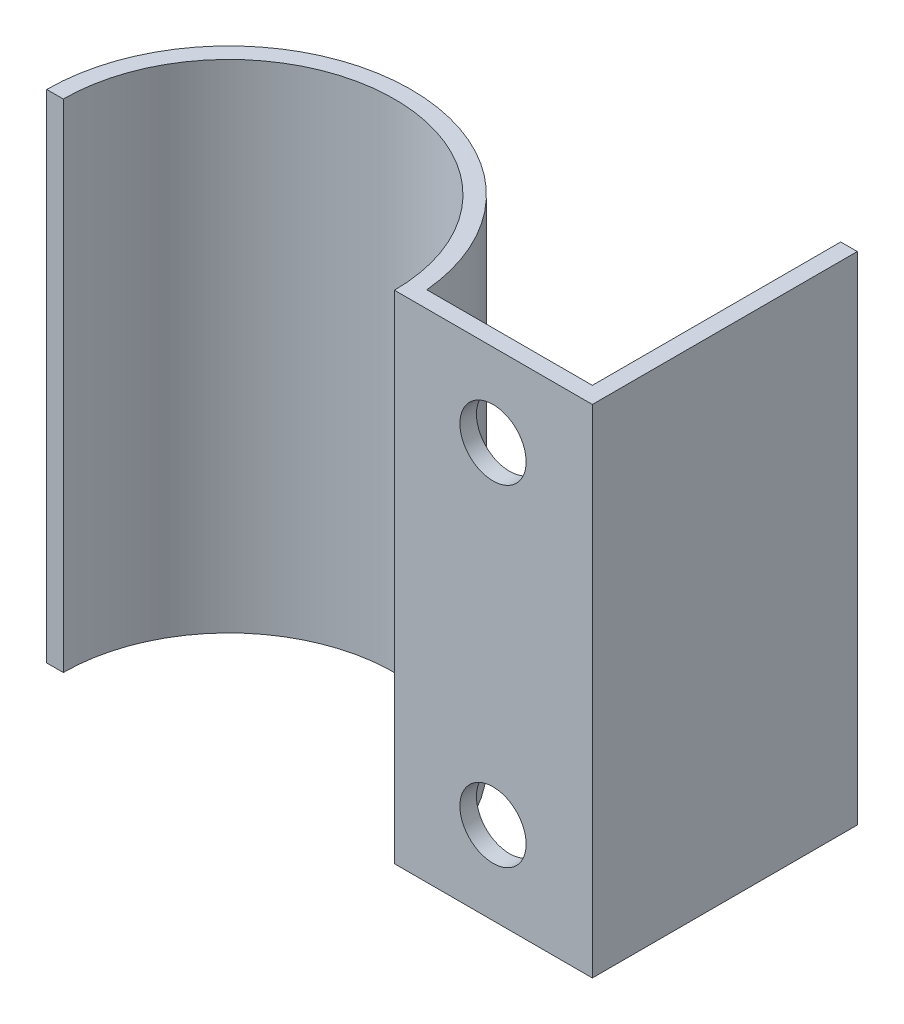
ISO-10303-21;
HEADER;
FILE_DESCRIPTION(('STEP AP214'),'2;1');
FILE_NAME('part.step','',(''),(''),'','','');
FILE_SCHEMA(('AUTOMOTIVE_DESIGN { 1 0 10303 214 1 1 1 1 }'));
ENDSEC;
DATA;
#1=APPLICATION_CONTEXT('core data for automotive mechanical design processes');
#2=APPLICATION_PROTOCOL_DEFINITION('international standard','automotive_design',2000,#1);
#3=PRODUCT_CONTEXT('',#1,'mechanical');
#4=PRODUCT('Part','Part','',(#3));
#5=PRODUCT_RELATED_PRODUCT_CATEGORY('part','',(#4));
#6=PRODUCT_DEFINITION_FORMATION('','',#4);
#7=PRODUCT_DEFINITION_CONTEXT('part definition',#1,'design');
#8=PRODUCT_DEFINITION('design','',#6,#7);
#9=PRODUCT_DEFINITION_SHAPE('','',#8);
#10=(LENGTH_UNIT() NAMED_UNIT(*) SI_UNIT(.MILLI.,.METRE.));
#11=(NAMED_UNIT(*) PLANE_ANGLE_UNIT() SI_UNIT($,.RADIAN.));
#12=(NAMED_UNIT(*) SI_UNIT($,.STERADIAN.) SOLID_ANGLE_UNIT());
#13=UNCERTAINTY_MEASURE_WITH_UNIT(LENGTH_MEASURE(1.E-05),#10,'distance_accuracy_value','');
#14=(GEOMETRIC_REPRESENTATION_CONTEXT(3) GLOBAL_UNCERTAINTY_ASSIGNED_CONTEXT((#13)) GLOBAL_UNIT_ASSIGNED_CONTEXT((#10,
#11,#12)) REPRESENTATION_CONTEXT('',''));
#15=CARTESIAN_POINT('',(0.,0.,0.));
#16=DIRECTION('',(0.,0.,1.));
#17=DIRECTION('',(1.,0.,0.));
#18=AXIS2_PLACEMENT_3D('',#15,#16,#17);
#19=CARTESIAN_POINT('',(0.,30.,0.));
#20=DIRECTION('',(0.,-1.,0.));
#21=DIRECTION('',(0.,0.,-1.));
#22=AXIS2_PLACEMENT_3D('',#19,#20,#21);
#23=CYLINDRICAL_SURFACE('',#22,11.);
#24=CARTESIAN_POINT('',(0.,0.,0.));
#25=DIRECTION('',(0.,1.,0.));
#26=DIRECTION('',(0.,0.,-1.));
#27=AXIS2_PLACEMENT_3D('',#24,#25,#26);
#28=CIRCLE('',#27,11.);
#29=CARTESIAN_POINT('',(10.9544511501033,0.,-1.));
#30=VERTEX_POINT('',#29);
#31=CARTESIAN_POINT('',(-11.,0.,0.));
#32=VERTEX_POINT('',#31);
#33=EDGE_CURVE('E129',#30,#32,#28,.T.);
#34=ORIENTED_EDGE('',*,*,#33,.T.);
#35=DIRECTION('',(0.,-1.,0.));
#36=VECTOR('',#35,1.);
#37=CARTESIAN_POINT('',(-11.,30.,0.));
#38=LINE('',#37,#36);
#39=CARTESIAN_POINT('',(-11.,30.,0.));
#40=VERTEX_POINT('',#39);
#41=EDGE_CURVE('E11',#40,#32,#38,.T.);
#42=ORIENTED_EDGE('',*,*,#41,.F.);
#43=CARTESIAN_POINT('',(0.,30.,0.));
#44=DIRECTION('',(0.,1.,0.));
#45=DIRECTION('',(0.,0.,-1.));
#46=AXIS2_PLACEMENT_3D('',#43,#44,#45);
#47=CIRCLE('',#46,11.);
#48=CARTESIAN_POINT('',(10.9544511501033,30.,-1.));
#49=VERTEX_POINT('',#48);
#50=EDGE_CURVE('E145',#49,#40,#47,.T.);
#51=ORIENTED_EDGE('',*,*,#50,.F.);
#52=DIRECTION('',(0.,-1.,0.));
#53=VECTOR('',#52,1.);
#54=CARTESIAN_POINT('',(10.9544511501033,30.,-1.));
#55=LINE('',#54,#53);
#56=EDGE_CURVE('E125',#49,#30,#55,.T.);
#57=ORIENTED_EDGE('',*,*,#56,.T.);
#58=EDGE_LOOP('',(#34,#42,#51,#57));
#59=FACE_BOUND('',#58,.T.);
#60=ADVANCED_FACE('F33',(#59),#23,.T.);
#61=CARTESIAN_POINT('',(-10.,30.,0.));
#62=DIRECTION('',(0.,0.,-1.));
#63=DIRECTION('',(-1.,0.,0.));
#64=AXIS2_PLACEMENT_3D('',#61,#62,#63);
#65=PLANE('',#64);
#66=DIRECTION('',(1.,0.,0.));
#67=VECTOR('',#66,1.);
#68=CARTESIAN_POINT('',(-10.,0.,0.));
#69=LINE('',#68,#67);
#70=CARTESIAN_POINT('',(-10.,0.,0.));
#71=VERTEX_POINT('',#70);
#72=EDGE_CURVE('E132',#32,#71,#69,.T.);
#73=ORIENTED_EDGE('',*,*,#72,.T.);
#74=DIRECTION('',(0.,-1.,0.));
#75=VECTOR('',#74,1.);
#76=CARTESIAN_POINT('',(-10.,30.,0.));
#77=LINE('',#76,#75);
#78=CARTESIAN_POINT('',(-10.,30.,0.));
#79=VERTEX_POINT('',#78);
#80=EDGE_CURVE('E41',#79,#71,#77,.T.);
#81=ORIENTED_EDGE('',*,*,#80,.F.);
#82=DIRECTION('',(1.,0.,0.));
#83=VECTOR('',#82,1.);
#84=CARTESIAN_POINT('',(-10.,30.,0.));
#85=LINE('',#84,#83);
#86=EDGE_CURVE('E92',#40,#79,#85,.T.);
#87=ORIENTED_EDGE('',*,*,#86,.F.);
#88=ORIENTED_EDGE('',*,*,#41,.T.);
#89=EDGE_LOOP('',(#73,#81,#87,#88));
#90=FACE_BOUND('',#89,.T.);
#91=ADVANCED_FACE('F212',(#90),#65,.F.);
#92=CARTESIAN_POINT('',(0.,30.,0.));
#93=DIRECTION('',(0.,-1.,0.));
#94=DIRECTION('',(0.,0.,-1.));
#95=AXIS2_PLACEMENT_3D('',#92,#93,#94);
#96=CYLINDRICAL_SURFACE('',#95,10.);
#97=CARTESIAN_POINT('',(0.,0.,0.));
#98=DIRECTION('',(0.,-1.,0.));
#99=DIRECTION('',(0.,0.,1.));
#100=AXIS2_PLACEMENT_3D('',#97,#98,#99);
#101=CIRCLE('',#100,10.);
#102=CARTESIAN_POINT('',(10.,0.,0.));
#103=VERTEX_POINT('',#102);
#104=EDGE_CURVE('E135',#71,#103,#101,.T.);
#105=ORIENTED_EDGE('',*,*,#104,.T.);
#106=DIRECTION('',(0.,-1.,0.));
#107=VECTOR('',#106,1.);
#108=CARTESIAN_POINT('',(10.,30.,0.));
#109=LINE('',#108,#107);
#110=CARTESIAN_POINT('',(10.,30.,0.));
#111=VERTEX_POINT('',#110);
#112=EDGE_CURVE('E152',#111,#103,#109,.T.);
#113=ORIENTED_EDGE('',*,*,#112,.F.);
#114=CARTESIAN_POINT('',(0.,30.,0.));
#115=DIRECTION('',(0.,-1.,0.));
#116=DIRECTION('',(0.,0.,1.));
#117=AXIS2_PLACEMENT_3D('',#114,#115,#116);
#118=CIRCLE('',#117,10.);
#119=EDGE_CURVE('E160',#79,#111,#118,.T.);
#120=ORIENTED_EDGE('',*,*,#119,.F.);
#121=ORIENTED_EDGE('',*,*,#80,.T.);
#122=EDGE_LOOP('',(#105,#113,#120,#121));
#123=FACE_BOUND('',#122,.T.);
#124=ADVANCED_FACE('F158',(#123),#96,.F.);
#125=CARTESIAN_POINT('',(21.9544511501033,30.,0.));
#126=DIRECTION('',(0.,0.,-1.));
#127=DIRECTION('',(-1.,0.,0.));
#128=AXIS2_PLACEMENT_3D('',#125,#126,#127);
#129=PLANE('',#128);
#130=CARTESIAN_POINT('',(15.9544511501033,25.,0.));
#131=DIRECTION('',(0.,0.,-1.));
#132=DIRECTION('',(-1.,0.,0.));
#133=AXIS2_PLACEMENT_3D('',#130,#131,#132);
#134=CIRCLE('',#133,2.);
#135=CARTESIAN_POINT('',(13.9544511501033,25.,0.));
#136=VERTEX_POINT('',#135);
#137=EDGE_CURVE('E133',#136,#136,#134,.T.);
#138=ORIENTED_EDGE('',*,*,#137,.T.);
#139=EDGE_LOOP('',(#138));
#140=FACE_BOUND('',#139,.T.);
#141=CARTESIAN_POINT('',(15.9544511501033,5.,0.));
#142=DIRECTION('',(0.,0.,-1.));
#143=DIRECTION('',(-1.,0.,0.));
#144=AXIS2_PLACEMENT_3D('',#141,#142,#143);
#145=CIRCLE('',#144,2.);
#146=CARTESIAN_POINT('',(13.9544511501033,5.,0.));
#147=VERTEX_POINT('',#146);
#148=EDGE_CURVE('E179',#147,#147,#145,.T.);
#149=ORIENTED_EDGE('',*,*,#148,.T.);
#150=EDGE_LOOP('',(#149));
#151=FACE_BOUND('',#150,.T.);
#152=DIRECTION('',(1.,0.,0.));
#153=VECTOR('',#152,1.);
#154=CARTESIAN_POINT('',(21.9544511501033,0.,0.));
#155=LINE('',#154,#153);
#156=CARTESIAN_POINT('',(21.9544511501033,0.,0.));
#157=VERTEX_POINT('',#156);
#158=EDGE_CURVE('E138',#103,#157,#155,.T.);
#159=ORIENTED_EDGE('',*,*,#158,.T.);
#160=DIRECTION('',(0.,-1.,0.));
#161=VECTOR('',#160,1.);
#162=CARTESIAN_POINT('',(21.9544511501033,30.,0.));
#163=LINE('',#162,#161);
#164=CARTESIAN_POINT('',(21.9544511501033,30.,0.));
#165=VERTEX_POINT('',#164);
#166=EDGE_CURVE('E149',#165,#157,#163,.T.);
#167=ORIENTED_EDGE('',*,*,#166,.F.);
#168=DIRECTION('',(1.,0.,0.));
#169=VECTOR('',#168,1.);
#170=CARTESIAN_POINT('',(10.,30.,0.));
#171=LINE('',#170,#169);
#172=EDGE_CURVE('E171',#111,#165,#171,.T.);
#173=ORIENTED_EDGE('',*,*,#172,.F.);
#174=ORIENTED_EDGE('',*,*,#112,.T.);
#175=EDGE_LOOP('',(#159,#167,#173,#174));
#176=FACE_BOUND('',#175,.T.);
#177=ADVANCED_FACE('F167',(#140,#151,#176),#129,.F.);
#178=CARTESIAN_POINT('',(21.9544511501033,30.,-16.));
#179=DIRECTION('',(-1.,0.,0.));
#180=DIRECTION('',(0.,0.,1.));
#181=AXIS2_PLACEMENT_3D('',#178,#179,#180);
#182=PLANE('',#181);
#183=DIRECTION('',(0.,0.,-1.));
#184=VECTOR('',#183,1.);
#185=CARTESIAN_POINT('',(21.9544511501033,0.,-16.));
#186=LINE('',#185,#184);
#187=CARTESIAN_POINT('',(21.9544511501033,0.,-16.));
#188=VERTEX_POINT('',#187);
#189=EDGE_CURVE('E140',#157,#188,#186,.T.);
#190=ORIENTED_EDGE('',*,*,#189,.T.);
#191=DIRECTION('',(0.,-1.,0.));
#192=VECTOR('',#191,1.);
#193=CARTESIAN_POINT('',(21.9544511501033,30.,-16.));
#194=LINE('',#193,#192);
#195=CARTESIAN_POINT('',(21.9544511501033,30.,-16.));
#196=VERTEX_POINT('',#195);
#197=EDGE_CURVE('E120',#196,#188,#194,.T.);
#198=ORIENTED_EDGE('',*,*,#197,.F.);
#199=DIRECTION('',(0.,0.,-1.));
#200=VECTOR('',#199,1.);
#201=CARTESIAN_POINT('',(21.9544511501033,30.,-16.));
#202=LINE('',#201,#200);
#203=EDGE_CURVE('E111',#165,#196,#202,.T.);
#204=ORIENTED_EDGE('',*,*,#203,.F.);
#205=ORIENTED_EDGE('',*,*,#166,.T.);
#206=EDGE_LOOP('',(#190,#198,#204,#205));
#207=FACE_BOUND('',#206,.T.);
#208=ADVANCED_FACE('F170',(#207),#182,.F.);
#209=CARTESIAN_POINT('',(20.9544511501033,30.,-16.));
#210=DIRECTION('',(0.,0.,1.));
#211=DIRECTION('',(1.,0.,0.));
#212=AXIS2_PLACEMENT_3D('',#209,#210,#211);
#213=PLANE('',#212);
#214=DIRECTION('',(-1.,0.,0.));
#215=VECTOR('',#214,1.);
#216=CARTESIAN_POINT('',(20.9544511501033,0.,-16.));
#217=LINE('',#216,#215);
#218=CARTESIAN_POINT('',(20.9544511501033,0.,-16.));
#219=VERTEX_POINT('',#218);
#220=EDGE_CURVE('E119',#188,#219,#217,.T.);
#221=ORIENTED_EDGE('',*,*,#220,.T.);
#222=DIRECTION('',(0.,-1.,0.));
#223=VECTOR('',#222,1.);
#224=CARTESIAN_POINT('',(20.9544511501033,30.,-16.));
#225=LINE('',#224,#223);
#226=CARTESIAN_POINT('',(20.9544511501033,30.,-16.));
#227=VERTEX_POINT('',#226);
#228=EDGE_CURVE('E116',#227,#219,#225,.T.);
#229=ORIENTED_EDGE('',*,*,#228,.F.);
#230=DIRECTION('',(-1.,0.,0.));
#231=VECTOR('',#230,1.);
#232=CARTESIAN_POINT('',(20.9544511501033,30.,-16.));
#233=LINE('',#232,#231);
#234=EDGE_CURVE('E105',#196,#227,#233,.T.);
#235=ORIENTED_EDGE('',*,*,#234,.F.);
#236=ORIENTED_EDGE('',*,*,#197,.T.);
#237=EDGE_LOOP('',(#221,#229,#235,#236));
#238=FACE_BOUND('',#237,.T.);
#239=ADVANCED_FACE('F117',(#238),#213,.F.);
#240=CARTESIAN_POINT('',(20.9544511501033,30.,-1.));
#241=DIRECTION('',(1.,0.,0.));
#242=DIRECTION('',(0.,0.,-1.));
#243=AXIS2_PLACEMENT_3D('',#240,#241,#242);
#244=PLANE('',#243);
#245=DIRECTION('',(0.,0.,1.));
#246=VECTOR('',#245,1.);
#247=CARTESIAN_POINT('',(20.9544511501033,0.,-1.));
#248=LINE('',#247,#246);
#249=CARTESIAN_POINT('',(20.9544511501033,0.,-1.));
#250=VERTEX_POINT('',#249);
#251=EDGE_CURVE('E78',#219,#250,#248,.T.);
#252=ORIENTED_EDGE('',*,*,#251,.T.);
#253=DIRECTION('',(0.,-1.,0.));
#254=VECTOR('',#253,1.);
#255=CARTESIAN_POINT('',(20.9544511501033,30.,-1.));
#256=LINE('',#255,#254);
#257=CARTESIAN_POINT('',(20.9544511501033,30.,-1.));
#258=VERTEX_POINT('',#257);
#259=EDGE_CURVE('E121',#258,#250,#256,.T.);
#260=ORIENTED_EDGE('',*,*,#259,.F.);
#261=DIRECTION('',(0.,0.,1.));
#262=VECTOR('',#261,1.);
#263=CARTESIAN_POINT('',(20.9544511501033,30.,-1.));
#264=LINE('',#263,#262);
#265=EDGE_CURVE('E109',#227,#258,#264,.T.);
#266=ORIENTED_EDGE('',*,*,#265,.F.);
#267=ORIENTED_EDGE('',*,*,#228,.T.);
#268=EDGE_LOOP('',(#252,#260,#266,#267));
#269=FACE_BOUND('',#268,.T.);
#270=ADVANCED_FACE('F123',(#269),#244,.F.);
#271=CARTESIAN_POINT('',(20.9544511501033,30.,-1.));
#272=DIRECTION('',(0.,0.,1.));
#273=DIRECTION('',(1.,0.,0.));
#274=AXIS2_PLACEMENT_3D('',#271,#272,#273);
#275=PLANE('',#274);
#276=CARTESIAN_POINT('',(15.9544511501033,25.,-0.999999999999999));
#277=DIRECTION('',(0.,0.,-1.));
#278=DIRECTION('',(-1.,0.,0.));
#279=AXIS2_PLACEMENT_3D('',#276,#277,#278);
#280=CIRCLE('',#279,2.);
#281=CARTESIAN_POINT('',(13.9544511501033,25.,-0.999999999999999));
#282=VERTEX_POINT('',#281);
#283=EDGE_CURVE('E182',#282,#282,#280,.T.);
#284=ORIENTED_EDGE('',*,*,#283,.F.);
#285=EDGE_LOOP('',(#284));
#286=FACE_BOUND('',#285,.T.);
#287=CARTESIAN_POINT('',(15.9544511501033,5.,-0.999999999999999));
#288=DIRECTION('',(0.,0.,-1.));
#289=DIRECTION('',(-1.,0.,0.));
#290=AXIS2_PLACEMENT_3D('',#287,#288,#289);
#291=CIRCLE('',#290,2.);
#292=CARTESIAN_POINT('',(13.9544511501033,5.,-0.999999999999999));
#293=VERTEX_POINT('',#292);
#294=EDGE_CURVE('E183',#293,#293,#291,.T.);
#295=ORIENTED_EDGE('',*,*,#294,.F.);
#296=EDGE_LOOP('',(#295));
#297=FACE_BOUND('',#296,.T.);
#298=DIRECTION('',(-1.,0.,0.));
#299=VECTOR('',#298,1.);
#300=CARTESIAN_POINT('',(20.9544511501033,0.,-1.));
#301=LINE('',#300,#299);
#302=EDGE_CURVE('E84',#250,#30,#301,.T.);
#303=ORIENTED_EDGE('',*,*,#302,.T.);
#304=ORIENTED_EDGE('',*,*,#56,.F.);
#305=DIRECTION('',(-1.,0.,0.));
#306=VECTOR('',#305,1.);
#307=CARTESIAN_POINT('',(20.9544511501033,30.,-1.));
#308=LINE('',#307,#306);
#309=EDGE_CURVE('E49',#258,#49,#308,.T.);
#310=ORIENTED_EDGE('',*,*,#309,.F.);
#311=ORIENTED_EDGE('',*,*,#259,.T.);
#312=EDGE_LOOP('',(#303,#304,#310,#311));
#313=FACE_BOUND('',#312,.T.);
#314=ADVANCED_FACE('F192',(#286,#297,#313),#275,.F.);
#315=CARTESIAN_POINT('',(0.,30.,0.));
#316=DIRECTION('',(0.,-1.,0.));
#317=DIRECTION('',(0.,0.,-1.));
#318=AXIS2_PLACEMENT_3D('',#315,#316,#317);
#319=PLANE('',#318);
#320=ORIENTED_EDGE('',*,*,#50,.T.);
#321=ORIENTED_EDGE('',*,*,#86,.T.);
#322=ORIENTED_EDGE('',*,*,#119,.T.);
#323=ORIENTED_EDGE('',*,*,#172,.T.);
#324=ORIENTED_EDGE('',*,*,#203,.T.);
#325=ORIENTED_EDGE('',*,*,#234,.T.);
#326=ORIENTED_EDGE('',*,*,#265,.T.);
#327=ORIENTED_EDGE('',*,*,#309,.T.);
#328=EDGE_LOOP('',(#320,#321,#322,#323,#324,#325,#326,#327));
#329=FACE_BOUND('',#328,.T.);
#330=ADVANCED_FACE('F107',(#329),#319,.F.);
#331=CARTESIAN_POINT('',(0.,0.,0.));
#332=DIRECTION('',(0.,-1.,0.));
#333=DIRECTION('',(0.,0.,-1.));
#334=AXIS2_PLACEMENT_3D('',#331,#332,#333);
#335=PLANE('',#334);
#336=ORIENTED_EDGE('',*,*,#33,.F.);
#337=ORIENTED_EDGE('',*,*,#302,.F.);
#338=ORIENTED_EDGE('',*,*,#251,.F.);
#339=ORIENTED_EDGE('',*,*,#220,.F.);
#340=ORIENTED_EDGE('',*,*,#189,.F.);
#341=ORIENTED_EDGE('',*,*,#158,.F.);
#342=ORIENTED_EDGE('',*,*,#104,.F.);
#343=ORIENTED_EDGE('',*,*,#72,.F.);
#344=EDGE_LOOP('',(#336,#337,#338,#339,#340,#341,#342,#343));
#345=FACE_BOUND('',#344,.T.);
#346=ADVANCED_FACE('F163',(#345),#335,.T.);
#347=CARTESIAN_POINT('',(15.9544511501033,5.,29.));
#348=DIRECTION('',(0.,0.,-1.));
#349=DIRECTION('',(-1.,0.,0.));
#350=AXIS2_PLACEMENT_3D('',#347,#348,#349);
#351=CYLINDRICAL_SURFACE('',#350,2.);
#352=ORIENTED_EDGE('',*,*,#294,.T.);
#353=EDGE_LOOP('',(#352));
#354=FACE_BOUND('',#353,.T.);
#355=ORIENTED_EDGE('',*,*,#148,.F.);
#356=EDGE_LOOP('',(#355));
#357=FACE_BOUND('',#356,.T.);
#358=ADVANCED_FACE('F198',(#354,#357),#351,.F.);
#359=CARTESIAN_POINT('',(15.9544511501033,25.,29.));
#360=DIRECTION('',(0.,0.,-1.));
#361=DIRECTION('',(-1.,0.,0.));
#362=AXIS2_PLACEMENT_3D('',#359,#360,#361);
#363=CYLINDRICAL_SURFACE('',#362,2.);
#364=ORIENTED_EDGE('',*,*,#283,.T.);
#365=EDGE_LOOP('',(#364));
#366=FACE_BOUND('',#365,.T.);
#367=ORIENTED_EDGE('',*,*,#137,.F.);
#368=EDGE_LOOP('',(#367));
#369=FACE_BOUND('',#368,.T.);
#370=ADVANCED_FACE('F189',(#366,#369),#363,.F.);
#371=CLOSED_SHELL('',(#60,#91,#124,#177,#208,#239,#270,#314,#330,#346,#358,#370));
#372=MANIFOLD_SOLID_BREP('B2',#371);
#373=ADVANCED_BREP_SHAPE_REPRESENTATION('',(#18,#372),#14);
#374=SHAPE_DEFINITION_REPRESENTATION(#9,#373);
ENDSEC;
END-ISO-10303-21;
